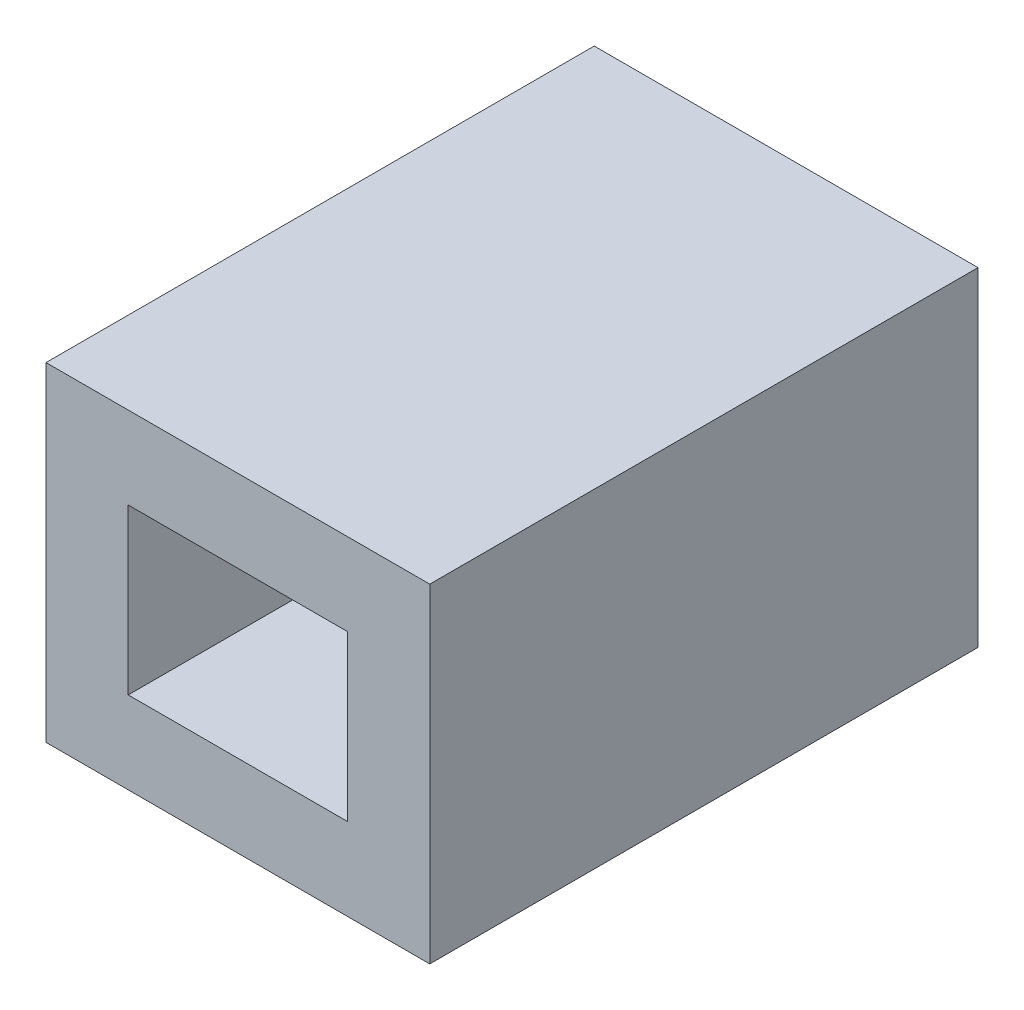
ISO-10303-21;
HEADER;
FILE_DESCRIPTION(('STEP AP214'),'2;1');
FILE_NAME('part.step','',(''),(''),'','','');
FILE_SCHEMA(('AUTOMOTIVE_DESIGN { 1 0 10303 214 1 1 1 1 }'));
ENDSEC;
DATA;
#1=APPLICATION_CONTEXT('core data for automotive mechanical design processes');
#2=APPLICATION_PROTOCOL_DEFINITION('international standard','automotive_design',2000,#1);
#3=PRODUCT_CONTEXT('',#1,'mechanical');
#4=PRODUCT('Part','Part','',(#3));
#5=PRODUCT_RELATED_PRODUCT_CATEGORY('part','',(#4));
#6=PRODUCT_DEFINITION_FORMATION('','',#4);
#7=PRODUCT_DEFINITION_CONTEXT('part definition',#1,'design');
#8=PRODUCT_DEFINITION('design','',#6,#7);
#9=PRODUCT_DEFINITION_SHAPE('','',#8);
#10=(LENGTH_UNIT() NAMED_UNIT(*) SI_UNIT(.MILLI.,.METRE.));
#11=(NAMED_UNIT(*) PLANE_ANGLE_UNIT() SI_UNIT($,.RADIAN.));
#12=(NAMED_UNIT(*) SI_UNIT($,.STERADIAN.) SOLID_ANGLE_UNIT());
#13=UNCERTAINTY_MEASURE_WITH_UNIT(LENGTH_MEASURE(1.E-05),#10,'distance_accuracy_value','');
#14=(GEOMETRIC_REPRESENTATION_CONTEXT(3) GLOBAL_UNCERTAINTY_ASSIGNED_CONTEXT((#13)) GLOBAL_UNIT_ASSIGNED_CONTEXT((#10,
#11,#12)) REPRESENTATION_CONTEXT('',''));
#15=CARTESIAN_POINT('',(0.,0.,0.));
#16=DIRECTION('',(0.,0.,1.));
#17=DIRECTION('',(1.,0.,0.));
#18=AXIS2_PLACEMENT_3D('',#15,#16,#17);
#19=CARTESIAN_POINT('',(0.,0.,20.));
#20=DIRECTION('',(0.,0.,1.));
#21=DIRECTION('',(1.,0.,0.));
#22=AXIS2_PLACEMENT_3D('',#19,#20,#21);
#23=PLANE('',#22);
#24=DIRECTION('',(0.,-1.,0.));
#25=VECTOR('',#24,1.);
#26=CARTESIAN_POINT('',(0.,12.,20.));
#27=LINE('',#26,#25);
#28=CARTESIAN_POINT('',(0.,12.,20.));
#29=VERTEX_POINT('',#28);
#30=CARTESIAN_POINT('',(0.,0.,20.));
#31=VERTEX_POINT('',#30);
#32=EDGE_CURVE('E131',#29,#31,#27,.T.);
#33=ORIENTED_EDGE('',*,*,#32,.T.);
#34=DIRECTION('',(1.,0.,0.));
#35=VECTOR('',#34,1.);
#36=CARTESIAN_POINT('',(0.,0.,20.));
#37=LINE('',#36,#35);
#38=CARTESIAN_POINT('',(14.,0.,20.));
#39=VERTEX_POINT('',#38);
#40=EDGE_CURVE('E134',#31,#39,#37,.T.);
#41=ORIENTED_EDGE('',*,*,#40,.T.);
#42=DIRECTION('',(0.,1.,0.));
#43=VECTOR('',#42,1.);
#44=CARTESIAN_POINT('',(14.,12.,20.));
#45=LINE('',#44,#43);
#46=CARTESIAN_POINT('',(14.,12.,20.));
#47=VERTEX_POINT('',#46);
#48=EDGE_CURVE('E137',#39,#47,#45,.T.);
#49=ORIENTED_EDGE('',*,*,#48,.T.);
#50=DIRECTION('',(-1.,0.,0.));
#51=VECTOR('',#50,1.);
#52=CARTESIAN_POINT('',(0.,12.,20.));
#53=LINE('',#52,#51);
#54=EDGE_CURVE('E139',#47,#29,#53,.T.);
#55=ORIENTED_EDGE('',*,*,#54,.T.);
#56=EDGE_LOOP('',(#33,#41,#49,#55));
#57=FACE_BOUND('',#56,.T.);
#58=DIRECTION('',(1.,0.,0.));
#59=VECTOR('',#58,1.);
#60=CARTESIAN_POINT('',(3.,3.,20.));
#61=LINE('',#60,#59);
#62=CARTESIAN_POINT('',(3.,3.,20.));
#63=VERTEX_POINT('',#62);
#64=CARTESIAN_POINT('',(11.,3.,20.));
#65=VERTEX_POINT('',#64);
#66=EDGE_CURVE('E103',#63,#65,#61,.T.);
#67=ORIENTED_EDGE('',*,*,#66,.F.);
#68=DIRECTION('',(0.,-1.,0.));
#69=VECTOR('',#68,1.);
#70=CARTESIAN_POINT('',(3.,9.,20.));
#71=LINE('',#70,#69);
#72=CARTESIAN_POINT('',(3.,9.,20.));
#73=VERTEX_POINT('',#72);
#74=EDGE_CURVE('E95',#73,#63,#71,.T.);
#75=ORIENTED_EDGE('',*,*,#74,.F.);
#76=DIRECTION('',(-1.,0.,0.));
#77=VECTOR('',#76,1.);
#78=CARTESIAN_POINT('',(3.,9.,20.));
#79=LINE('',#78,#77);
#80=CARTESIAN_POINT('',(11.,9.,20.));
#81=VERTEX_POINT('',#80);
#82=EDGE_CURVE('E117',#81,#73,#79,.T.);
#83=ORIENTED_EDGE('',*,*,#82,.F.);
#84=DIRECTION('',(0.,1.,0.));
#85=VECTOR('',#84,1.);
#86=CARTESIAN_POINT('',(11.,9.,20.));
#87=LINE('',#86,#85);
#88=EDGE_CURVE('E115',#65,#81,#87,.T.);
#89=ORIENTED_EDGE('',*,*,#88,.F.);
#90=EDGE_LOOP('',(#67,#75,#83,#89));
#91=FACE_BOUND('',#90,.T.);
#92=ADVANCED_FACE('F30',(#57,#91),#23,.T.);
#93=CARTESIAN_POINT('',(0.,0.,0.));
#94=DIRECTION('',(0.,0.,1.));
#95=DIRECTION('',(1.,0.,0.));
#96=AXIS2_PLACEMENT_3D('',#93,#94,#95);
#97=PLANE('',#96);
#98=DIRECTION('',(0.,-1.,0.));
#99=VECTOR('',#98,1.);
#100=CARTESIAN_POINT('',(0.,12.,0.));
#101=LINE('',#100,#99);
#102=CARTESIAN_POINT('',(0.,12.,0.));
#103=VERTEX_POINT('',#102);
#104=CARTESIAN_POINT('',(0.,0.,0.));
#105=VERTEX_POINT('',#104);
#106=EDGE_CURVE('E111',#103,#105,#101,.T.);
#107=ORIENTED_EDGE('',*,*,#106,.F.);
#108=DIRECTION('',(-1.,0.,0.));
#109=VECTOR('',#108,1.);
#110=CARTESIAN_POINT('',(0.,12.,0.));
#111=LINE('',#110,#109);
#112=CARTESIAN_POINT('',(14.,12.,0.));
#113=VERTEX_POINT('',#112);
#114=EDGE_CURVE('E135',#113,#103,#111,.T.);
#115=ORIENTED_EDGE('',*,*,#114,.F.);
#116=DIRECTION('',(0.,1.,0.));
#117=VECTOR('',#116,1.);
#118=CARTESIAN_POINT('',(14.,12.,0.));
#119=LINE('',#118,#117);
#120=CARTESIAN_POINT('',(14.,0.,0.));
#121=VERTEX_POINT('',#120);
#122=EDGE_CURVE('E146',#121,#113,#119,.T.);
#123=ORIENTED_EDGE('',*,*,#122,.F.);
#124=DIRECTION('',(1.,0.,0.));
#125=VECTOR('',#124,1.);
#126=CARTESIAN_POINT('',(0.,0.,0.));
#127=LINE('',#126,#125);
#128=EDGE_CURVE('E144',#105,#121,#127,.T.);
#129=ORIENTED_EDGE('',*,*,#128,.F.);
#130=EDGE_LOOP('',(#107,#115,#123,#129));
#131=FACE_BOUND('',#130,.T.);
#132=DIRECTION('',(0.,-1.,0.));
#133=VECTOR('',#132,1.);
#134=CARTESIAN_POINT('',(3.,9.,0.));
#135=LINE('',#134,#133);
#136=CARTESIAN_POINT('',(3.,9.,0.));
#137=VERTEX_POINT('',#136);
#138=CARTESIAN_POINT('',(3.,3.,0.));
#139=VERTEX_POINT('',#138);
#140=EDGE_CURVE('E53',#137,#139,#135,.T.);
#141=ORIENTED_EDGE('',*,*,#140,.T.);
#142=DIRECTION('',(1.,0.,0.));
#143=VECTOR('',#142,1.);
#144=CARTESIAN_POINT('',(3.,3.,0.));
#145=LINE('',#144,#143);
#146=CARTESIAN_POINT('',(11.,3.,0.));
#147=VERTEX_POINT('',#146);
#148=EDGE_CURVE('E110',#139,#147,#145,.T.);
#149=ORIENTED_EDGE('',*,*,#148,.T.);
#150=DIRECTION('',(0.,1.,0.));
#151=VECTOR('',#150,1.);
#152=CARTESIAN_POINT('',(11.,9.,0.));
#153=LINE('',#152,#151);
#154=CARTESIAN_POINT('',(11.,9.,0.));
#155=VERTEX_POINT('',#154);
#156=EDGE_CURVE('E123',#147,#155,#153,.T.);
#157=ORIENTED_EDGE('',*,*,#156,.T.);
#158=DIRECTION('',(-1.,0.,0.));
#159=VECTOR('',#158,1.);
#160=CARTESIAN_POINT('',(3.,9.,0.));
#161=LINE('',#160,#159);
#162=EDGE_CURVE('E104',#155,#137,#161,.T.);
#163=ORIENTED_EDGE('',*,*,#162,.T.);
#164=EDGE_LOOP('',(#141,#149,#157,#163));
#165=FACE_BOUND('',#164,.T.);
#166=ADVANCED_FACE('F164',(#131,#165),#97,.F.);
#167=CARTESIAN_POINT('',(0.,12.,20.));
#168=DIRECTION('',(1.,0.,0.));
#169=DIRECTION('',(0.,1.,0.));
#170=AXIS2_PLACEMENT_3D('',#167,#168,#169);
#171=PLANE('',#170);
#172=ORIENTED_EDGE('',*,*,#106,.T.);
#173=DIRECTION('',(0.,0.,-1.));
#174=VECTOR('',#173,1.);
#175=CARTESIAN_POINT('',(0.,0.,20.));
#176=LINE('',#175,#174);
#177=EDGE_CURVE('E11',#31,#105,#176,.T.);
#178=ORIENTED_EDGE('',*,*,#177,.F.);
#179=ORIENTED_EDGE('',*,*,#32,.F.);
#180=DIRECTION('',(0.,0.,-1.));
#181=VECTOR('',#180,1.);
#182=CARTESIAN_POINT('',(0.,12.,20.));
#183=LINE('',#182,#181);
#184=EDGE_CURVE('E141',#29,#103,#183,.T.);
#185=ORIENTED_EDGE('',*,*,#184,.T.);
#186=EDGE_LOOP('',(#172,#178,#179,#185));
#187=FACE_BOUND('',#186,.T.);
#188=ADVANCED_FACE('F32',(#187),#171,.F.);
#189=CARTESIAN_POINT('',(0.,0.,20.));
#190=DIRECTION('',(0.,1.,0.));
#191=DIRECTION('',(0.,0.,1.));
#192=AXIS2_PLACEMENT_3D('',#189,#190,#191);
#193=PLANE('',#192);
#194=ORIENTED_EDGE('',*,*,#128,.T.);
#195=DIRECTION('',(0.,0.,-1.));
#196=VECTOR('',#195,1.);
#197=CARTESIAN_POINT('',(14.,0.,20.));
#198=LINE('',#197,#196);
#199=EDGE_CURVE('E38',#39,#121,#198,.T.);
#200=ORIENTED_EDGE('',*,*,#199,.F.);
#201=ORIENTED_EDGE('',*,*,#40,.F.);
#202=ORIENTED_EDGE('',*,*,#177,.T.);
#203=EDGE_LOOP('',(#194,#200,#201,#202));
#204=FACE_BOUND('',#203,.T.);
#205=ADVANCED_FACE('F174',(#204),#193,.F.);
#206=CARTESIAN_POINT('',(14.,12.,20.));
#207=DIRECTION('',(-1.,0.,0.));
#208=DIRECTION('',(0.,-1.,0.));
#209=AXIS2_PLACEMENT_3D('',#206,#207,#208);
#210=PLANE('',#209);
#211=ORIENTED_EDGE('',*,*,#122,.T.);
#212=DIRECTION('',(0.,0.,-1.));
#213=VECTOR('',#212,1.);
#214=CARTESIAN_POINT('',(14.,12.,20.));
#215=LINE('',#214,#213);
#216=EDGE_CURVE('E151',#47,#113,#215,.T.);
#217=ORIENTED_EDGE('',*,*,#216,.F.);
#218=ORIENTED_EDGE('',*,*,#48,.F.);
#219=ORIENTED_EDGE('',*,*,#199,.T.);
#220=EDGE_LOOP('',(#211,#217,#218,#219));
#221=FACE_BOUND('',#220,.T.);
#222=ADVANCED_FACE('F158',(#221),#210,.F.);
#223=CARTESIAN_POINT('',(0.,12.,20.));
#224=DIRECTION('',(0.,-1.,0.));
#225=DIRECTION('',(0.,0.,-1.));
#226=AXIS2_PLACEMENT_3D('',#223,#224,#225);
#227=PLANE('',#226);
#228=ORIENTED_EDGE('',*,*,#114,.T.);
#229=ORIENTED_EDGE('',*,*,#184,.F.);
#230=ORIENTED_EDGE('',*,*,#54,.F.);
#231=ORIENTED_EDGE('',*,*,#216,.T.);
#232=EDGE_LOOP('',(#228,#229,#230,#231));
#233=FACE_BOUND('',#232,.T.);
#234=ADVANCED_FACE('F168',(#233),#227,.F.);
#235=CARTESIAN_POINT('',(3.,9.,20.));
#236=DIRECTION('',(1.,0.,0.));
#237=DIRECTION('',(0.,1.,0.));
#238=AXIS2_PLACEMENT_3D('',#235,#236,#237);
#239=PLANE('',#238);
#240=ORIENTED_EDGE('',*,*,#140,.F.);
#241=DIRECTION('',(0.,0.,-1.));
#242=VECTOR('',#241,1.);
#243=CARTESIAN_POINT('',(3.,9.,20.));
#244=LINE('',#243,#242);
#245=EDGE_CURVE('E99',#73,#137,#244,.T.);
#246=ORIENTED_EDGE('',*,*,#245,.F.);
#247=ORIENTED_EDGE('',*,*,#74,.T.);
#248=DIRECTION('',(0.,0.,-1.));
#249=VECTOR('',#248,1.);
#250=CARTESIAN_POINT('',(3.,3.,20.));
#251=LINE('',#250,#249);
#252=EDGE_CURVE('E98',#63,#139,#251,.T.);
#253=ORIENTED_EDGE('',*,*,#252,.T.);
#254=EDGE_LOOP('',(#240,#246,#247,#253));
#255=FACE_BOUND('',#254,.T.);
#256=ADVANCED_FACE('F97',(#255),#239,.T.);
#257=CARTESIAN_POINT('',(3.,3.,20.));
#258=DIRECTION('',(0.,1.,0.));
#259=DIRECTION('',(0.,0.,1.));
#260=AXIS2_PLACEMENT_3D('',#257,#258,#259);
#261=PLANE('',#260);
#262=ORIENTED_EDGE('',*,*,#148,.F.);
#263=ORIENTED_EDGE('',*,*,#252,.F.);
#264=ORIENTED_EDGE('',*,*,#66,.T.);
#265=DIRECTION('',(0.,0.,-1.));
#266=VECTOR('',#265,1.);
#267=CARTESIAN_POINT('',(11.,3.,20.));
#268=LINE('',#267,#266);
#269=EDGE_CURVE('E112',#65,#147,#268,.T.);
#270=ORIENTED_EDGE('',*,*,#269,.T.);
#271=EDGE_LOOP('',(#262,#263,#264,#270));
#272=FACE_BOUND('',#271,.T.);
#273=ADVANCED_FACE('F107',(#272),#261,.T.);
#274=CARTESIAN_POINT('',(11.,9.,20.));
#275=DIRECTION('',(-1.,0.,0.));
#276=DIRECTION('',(0.,0.,1.));
#277=AXIS2_PLACEMENT_3D('',#274,#275,#276);
#278=PLANE('',#277);
#279=ORIENTED_EDGE('',*,*,#156,.F.);
#280=ORIENTED_EDGE('',*,*,#269,.F.);
#281=ORIENTED_EDGE('',*,*,#88,.T.);
#282=DIRECTION('',(0.,0.,-1.));
#283=VECTOR('',#282,1.);
#284=CARTESIAN_POINT('',(11.,9.,20.));
#285=LINE('',#284,#283);
#286=EDGE_CURVE('E45',#81,#155,#285,.T.);
#287=ORIENTED_EDGE('',*,*,#286,.T.);
#288=EDGE_LOOP('',(#279,#280,#281,#287));
#289=FACE_BOUND('',#288,.T.);
#290=ADVANCED_FACE('F197',(#289),#278,.T.);
#291=CARTESIAN_POINT('',(3.,9.,20.));
#292=DIRECTION('',(0.,-1.,0.));
#293=DIRECTION('',(0.,0.,-1.));
#294=AXIS2_PLACEMENT_3D('',#291,#292,#293);
#295=PLANE('',#294);
#296=ORIENTED_EDGE('',*,*,#162,.F.);
#297=ORIENTED_EDGE('',*,*,#286,.F.);
#298=ORIENTED_EDGE('',*,*,#82,.T.);
#299=ORIENTED_EDGE('',*,*,#245,.T.);
#300=EDGE_LOOP('',(#296,#297,#298,#299));
#301=FACE_BOUND('',#300,.T.);
#302=ADVANCED_FACE('F201',(#301),#295,.T.);
#303=CLOSED_SHELL('',(#92,#166,#188,#205,#222,#234,#256,#273,#290,#302));
#304=MANIFOLD_SOLID_BREP('B2',#303);
#305=ADVANCED_BREP_SHAPE_REPRESENTATION('',(#18,#304),#14);
#306=SHAPE_DEFINITION_REPRESENTATION(#9,#305);
ENDSEC;
END-ISO-10303-21;
